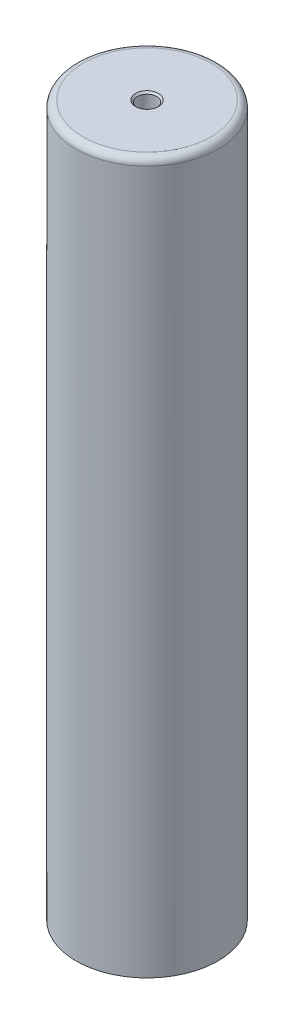
ISO-10303-21;
HEADER;
FILE_DESCRIPTION(('STEP AP214'),'2;1');
FILE_NAME('part.step','',(''),(''),'','','');
FILE_SCHEMA(('AUTOMOTIVE_DESIGN { 1 0 10303 214 1 1 1 1 }'));
ENDSEC;
DATA;
#1=APPLICATION_CONTEXT('core data for automotive mechanical design processes');
#2=APPLICATION_PROTOCOL_DEFINITION('international standard','automotive_design',2000,#1);
#3=PRODUCT_CONTEXT('',#1,'mechanical');
#4=PRODUCT('Part','Part','',(#3));
#5=PRODUCT_RELATED_PRODUCT_CATEGORY('part','',(#4));
#6=PRODUCT_DEFINITION_FORMATION('','',#4);
#7=PRODUCT_DEFINITION_CONTEXT('part definition',#1,'design');
#8=PRODUCT_DEFINITION('design','',#6,#7);
#9=PRODUCT_DEFINITION_SHAPE('','',#8);
#10=(LENGTH_UNIT() NAMED_UNIT(*) SI_UNIT(.MILLI.,.METRE.));
#11=(NAMED_UNIT(*) PLANE_ANGLE_UNIT() SI_UNIT($,.RADIAN.));
#12=(NAMED_UNIT(*) SI_UNIT($,.STERADIAN.) SOLID_ANGLE_UNIT());
#13=UNCERTAINTY_MEASURE_WITH_UNIT(LENGTH_MEASURE(1.E-05),#10,'distance_accuracy_value','');
#14=(GEOMETRIC_REPRESENTATION_CONTEXT(3) GLOBAL_UNCERTAINTY_ASSIGNED_CONTEXT((#13)) GLOBAL_UNIT_ASSIGNED_CONTEXT((#10,
#11,#12)) REPRESENTATION_CONTEXT('',''));
#15=CARTESIAN_POINT('',(0.,0.,0.));
#16=DIRECTION('',(0.,0.,1.));
#17=DIRECTION('',(1.,0.,0.));
#18=AXIS2_PLACEMENT_3D('',#15,#16,#17);
#19=CARTESIAN_POINT('',(0.,250.,0.));
#20=DIRECTION('',(0.,1.,0.));
#21=DIRECTION('',(0.,0.,1.));
#22=AXIS2_PLACEMENT_3D('',#19,#20,#21);
#23=PLANE('',#22);
#24=CARTESIAN_POINT('',(0.,250.,0.));
#25=DIRECTION('',(0.,1.,0.));
#26=DIRECTION('',(0.,0.,1.));
#27=AXIS2_PLACEMENT_3D('',#24,#25,#26);
#28=CIRCLE('',#27,22.4999999999999);
#29=CARTESIAN_POINT('',(0.,250.,22.4999999999999));
#30=VERTEX_POINT('',#29);
#31=EDGE_CURVE('E11',#30,#30,#28,.T.);
#32=ORIENTED_EDGE('',*,*,#31,.T.);
#33=EDGE_LOOP('',(#32));
#34=FACE_BOUND('',#33,.T.);
#35=CARTESIAN_POINT('',(0.,250.,0.));
#36=DIRECTION('',(0.,1.,0.));
#37=DIRECTION('',(0.,0.,1.));
#38=AXIS2_PLACEMENT_3D('',#35,#36,#37);
#39=CIRCLE('',#38,4.025);
#40=CARTESIAN_POINT('',(0.,250.,4.025));
#41=VERTEX_POINT('',#40);
#42=EDGE_CURVE('E64',#41,#41,#39,.T.);
#43=ORIENTED_EDGE('',*,*,#42,.F.);
#44=EDGE_LOOP('',(#43));
#45=FACE_BOUND('',#44,.T.);
#46=ADVANCED_FACE('F38',(#34,#45),#23,.T.);
#47=CARTESIAN_POINT('',(0.,0.,0.));
#48=DIRECTION('',(0.,-1.,0.));
#49=DIRECTION('',(0.,0.,-1.));
#50=AXIS2_PLACEMENT_3D('',#47,#48,#49);
#51=CYLINDRICAL_SURFACE('',#50,24.9999999999999);
#52=CARTESIAN_POINT('',(0.,247.5,0.));
#53=DIRECTION('',(0.,1.,0.));
#54=DIRECTION('',(0.,0.,1.));
#55=AXIS2_PLACEMENT_3D('',#52,#53,#54);
#56=CIRCLE('',#55,24.9999999999999);
#57=CARTESIAN_POINT('',(0.,247.5,24.9999999999999));
#58=VERTEX_POINT('',#57);
#59=EDGE_CURVE('E45',#58,#58,#56,.F.);
#60=ORIENTED_EDGE('',*,*,#59,.T.);
#61=EDGE_LOOP('',(#60));
#62=FACE_BOUND('',#61,.T.);
#63=CARTESIAN_POINT('',(0.,0.,0.));
#64=DIRECTION('',(0.,-1.,0.));
#65=DIRECTION('',(0.,0.,-1.));
#66=AXIS2_PLACEMENT_3D('',#63,#64,#65);
#67=CIRCLE('',#66,24.9999999999998);
#68=CARTESIAN_POINT('',(0.,0.,-24.9999999999998));
#69=VERTEX_POINT('',#68);
#70=EDGE_CURVE('E58',#69,#69,#67,.T.);
#71=ORIENTED_EDGE('',*,*,#70,.F.);
#72=EDGE_LOOP('',(#71));
#73=FACE_BOUND('',#72,.T.);
#74=ADVANCED_FACE('F70',(#62,#73),#51,.T.);
#75=CARTESIAN_POINT('',(24.9999999999998,0.,0.));
#76=DIRECTION('',(0.,-1.,0.));
#77=DIRECTION('',(0.,0.,-1.));
#78=AXIS2_PLACEMENT_3D('',#75,#76,#77);
#79=PLANE('',#78);
#80=ORIENTED_EDGE('',*,*,#70,.T.);
#81=EDGE_LOOP('',(#80));
#82=FACE_BOUND('',#81,.T.);
#83=ADVANCED_FACE('F52',(#82),#79,.T.);
#84=CARTESIAN_POINT('',(0.,233.25,0.));
#85=DIRECTION('',(0.,1.,0.));
#86=DIRECTION('',(0.,0.,1.));
#87=AXIS2_PLACEMENT_3D('',#84,#85,#86);
#88=CONICAL_SURFACE('',#87,3.39999999999999,1.02974425867665);
#89=CARTESIAN_POINT('',(0.,231.207073895306,0.));
#90=VERTEX_POINT('',#89);
#91=VERTEX_LOOP('',#90);
#92=FACE_BOUND('',#91,.T.);
#93=CARTESIAN_POINT('',(0.,233.25,0.));
#94=DIRECTION('',(0.,1.,0.));
#95=DIRECTION('',(0.,0.,1.));
#96=AXIS2_PLACEMENT_3D('',#93,#94,#95);
#97=CIRCLE('',#96,3.39999999999999);
#98=CARTESIAN_POINT('',(0.,233.25,3.39999999999999));
#99=VERTEX_POINT('',#98);
#100=EDGE_CURVE('E56',#99,#99,#97,.T.);
#101=ORIENTED_EDGE('',*,*,#100,.T.);
#102=EDGE_LOOP('',(#101));
#103=FACE_BOUND('',#102,.T.);
#104=ADVANCED_FACE('F48',(#92,#103),#88,.F.);
#105=CARTESIAN_POINT('',(0.,250.,0.));
#106=DIRECTION('',(0.,1.,0.));
#107=DIRECTION('',(0.,0.,1.));
#108=AXIS2_PLACEMENT_3D('',#105,#106,#107);
#109=CYLINDRICAL_SURFACE('',#108,3.39999999999999);
#110=ORIENTED_EDGE('',*,*,#100,.F.);
#111=EDGE_LOOP('',(#110));
#112=FACE_BOUND('',#111,.T.);
#113=CARTESIAN_POINT('',(0.,249.375,0.));
#114=DIRECTION('',(0.,1.,0.));
#115=DIRECTION('',(0.,0.,1.));
#116=AXIS2_PLACEMENT_3D('',#113,#114,#115);
#117=CIRCLE('',#116,3.39999999999999);
#118=CARTESIAN_POINT('',(0.,249.375,3.39999999999999));
#119=VERTEX_POINT('',#118);
#120=EDGE_CURVE('E59',#119,#119,#117,.T.);
#121=ORIENTED_EDGE('',*,*,#120,.T.);
#122=EDGE_LOOP('',(#121));
#123=FACE_BOUND('',#122,.T.);
#124=ADVANCED_FACE('F51',(#112,#123),#109,.F.);
#125=CARTESIAN_POINT('',(0.,250.,0.));
#126=DIRECTION('',(0.,1.,0.));
#127=DIRECTION('',(0.,0.,1.));
#128=AXIS2_PLACEMENT_3D('',#125,#126,#127);
#129=CONICAL_SURFACE('',#128,4.025,0.785398163397447);
#130=ORIENTED_EDGE('',*,*,#120,.F.);
#131=EDGE_LOOP('',(#130));
#132=FACE_BOUND('',#131,.T.);
#133=ORIENTED_EDGE('',*,*,#42,.T.);
#134=EDGE_LOOP('',(#133));
#135=FACE_BOUND('',#134,.T.);
#136=ADVANCED_FACE('F74',(#132,#135),#129,.F.);
#137=CARTESIAN_POINT('',(0.,247.5,0.));
#138=DIRECTION('',(0.,1.,0.));
#139=DIRECTION('',(0.,0.,1.));
#140=AXIS2_PLACEMENT_3D('',#137,#138,#139);
#141=TOROIDAL_SURFACE('',#140,22.4999999999999,2.5);
#142=ORIENTED_EDGE('',*,*,#31,.F.);
#143=EDGE_LOOP('',(#142));
#144=FACE_BOUND('',#143,.T.);
#145=ORIENTED_EDGE('',*,*,#59,.F.);
#146=EDGE_LOOP('',(#145));
#147=FACE_BOUND('',#146,.T.);
#148=ADVANCED_FACE('F40',(#144,#147),#141,.T.);
#149=CLOSED_SHELL('',(#46,#74,#83,#104,#124,#136,#148));
#150=MANIFOLD_SOLID_BREP('B2',#149);
#151=ADVANCED_BREP_SHAPE_REPRESENTATION('',(#18,#150),#14);
#152=SHAPE_DEFINITION_REPRESENTATION(#9,#151);
ENDSEC;
END-ISO-10303-21;
